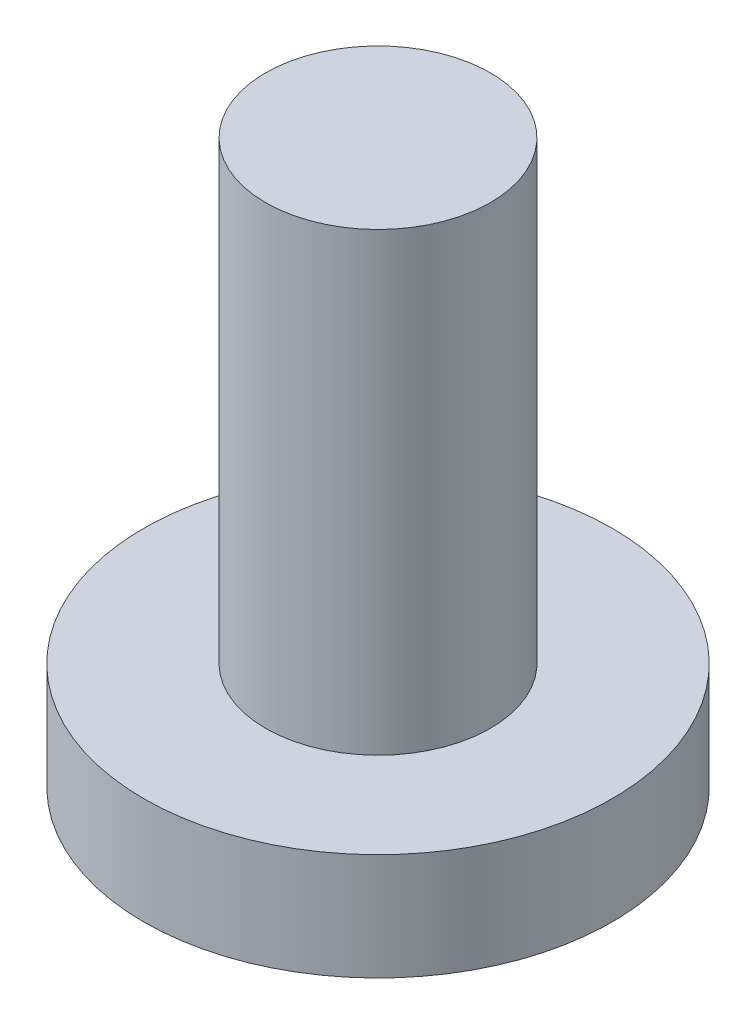
ISO-10303-21;
HEADER;
FILE_DESCRIPTION(('STEP AP214'),'2;1');
FILE_NAME('part.step','',(''),(''),'','','');
FILE_SCHEMA(('AUTOMOTIVE_DESIGN { 1 0 10303 214 1 1 1 1 }'));
ENDSEC;
DATA;
#1=APPLICATION_CONTEXT('core data for automotive mechanical design processes');
#2=APPLICATION_PROTOCOL_DEFINITION('international standard','automotive_design',2000,#1);
#3=PRODUCT_CONTEXT('',#1,'mechanical');
#4=PRODUCT('Part','Part','',(#3));
#5=PRODUCT_RELATED_PRODUCT_CATEGORY('part','',(#4));
#6=PRODUCT_DEFINITION_FORMATION('','',#4);
#7=PRODUCT_DEFINITION_CONTEXT('part definition',#1,'design');
#8=PRODUCT_DEFINITION('design','',#6,#7);
#9=PRODUCT_DEFINITION_SHAPE('','',#8);
#10=(LENGTH_UNIT() NAMED_UNIT(*) SI_UNIT(.MILLI.,.METRE.));
#11=(NAMED_UNIT(*) PLANE_ANGLE_UNIT() SI_UNIT($,.RADIAN.));
#12=(NAMED_UNIT(*) SI_UNIT($,.STERADIAN.) SOLID_ANGLE_UNIT());
#13=UNCERTAINTY_MEASURE_WITH_UNIT(LENGTH_MEASURE(1.E-05),#10,'distance_accuracy_value','');
#14=(GEOMETRIC_REPRESENTATION_CONTEXT(3) GLOBAL_UNCERTAINTY_ASSIGNED_CONTEXT((#13)) GLOBAL_UNIT_ASSIGNED_CONTEXT((#10,
#11,#12)) REPRESENTATION_CONTEXT('',''));
#15=CARTESIAN_POINT('',(0.,0.,0.));
#16=DIRECTION('',(0.,0.,1.));
#17=DIRECTION('',(1.,0.,0.));
#18=AXIS2_PLACEMENT_3D('',#15,#16,#17);
#19=CARTESIAN_POINT('',(0.,3.42,0.));
#20=DIRECTION('',(0.,1.,0.));
#21=DIRECTION('',(0.,0.,1.));
#22=AXIS2_PLACEMENT_3D('',#19,#20,#21);
#23=PLANE('',#22);
#24=CARTESIAN_POINT('',(0.,3.42,0.));
#25=DIRECTION('',(0.,1.,0.));
#26=DIRECTION('',(0.,0.,1.));
#27=AXIS2_PLACEMENT_3D('',#24,#25,#26);
#28=CIRCLE('',#27,7.5);
#29=CARTESIAN_POINT('',(0.,3.42,7.5));
#30=VERTEX_POINT('',#29);
#31=EDGE_CURVE('E10',#30,#30,#28,.T.);
#32=ORIENTED_EDGE('',*,*,#31,.T.);
#33=EDGE_LOOP('',(#32));
#34=FACE_BOUND('',#33,.T.);
#35=CARTESIAN_POINT('',(0.,3.42,0.));
#36=DIRECTION('',(0.,1.,0.));
#37=DIRECTION('',(0.,0.,1.));
#38=AXIS2_PLACEMENT_3D('',#35,#36,#37);
#39=CIRCLE('',#38,3.6);
#40=CARTESIAN_POINT('',(0.,3.42,3.6));
#41=VERTEX_POINT('',#40);
#42=EDGE_CURVE('E45',#41,#41,#39,.T.);
#43=ORIENTED_EDGE('',*,*,#42,.F.);
#44=EDGE_LOOP('',(#43));
#45=FACE_BOUND('',#44,.T.);
#46=ADVANCED_FACE('F34',(#34,#45),#23,.T.);
#47=CARTESIAN_POINT('',(0.,0.,0.));
#48=DIRECTION('',(0.,1.,0.));
#49=DIRECTION('',(0.,0.,1.));
#50=AXIS2_PLACEMENT_3D('',#47,#48,#49);
#51=PLANE('',#50);
#52=CARTESIAN_POINT('',(0.,0.,0.));
#53=DIRECTION('',(0.,1.,0.));
#54=DIRECTION('',(0.,0.,1.));
#55=AXIS2_PLACEMENT_3D('',#52,#53,#54);
#56=CIRCLE('',#55,7.5);
#57=CARTESIAN_POINT('',(0.,0.,7.5));
#58=VERTEX_POINT('',#57);
#59=EDGE_CURVE('E38',#58,#58,#56,.T.);
#60=ORIENTED_EDGE('',*,*,#59,.F.);
#61=EDGE_LOOP('',(#60));
#62=FACE_BOUND('',#61,.T.);
#63=ADVANCED_FACE('F64',(#62),#51,.F.);
#64=CARTESIAN_POINT('',(0.,3.42,0.));
#65=DIRECTION('',(0.,-1.,0.));
#66=DIRECTION('',(0.,0.,-1.));
#67=AXIS2_PLACEMENT_3D('',#64,#65,#66);
#68=CYLINDRICAL_SURFACE('',#67,7.5);
#69=ORIENTED_EDGE('',*,*,#31,.F.);
#70=EDGE_LOOP('',(#69));
#71=FACE_BOUND('',#70,.T.);
#72=ORIENTED_EDGE('',*,*,#59,.T.);
#73=EDGE_LOOP('',(#72));
#74=FACE_BOUND('',#73,.T.);
#75=ADVANCED_FACE('F36',(#71,#74),#68,.T.);
#76=CARTESIAN_POINT('',(0.,18.,0.));
#77=DIRECTION('',(0.,-1.,0.));
#78=DIRECTION('',(0.,0.,-1.));
#79=AXIS2_PLACEMENT_3D('',#76,#77,#78);
#80=CYLINDRICAL_SURFACE('',#79,3.6);
#81=ORIENTED_EDGE('',*,*,#42,.T.);
#82=EDGE_LOOP('',(#81));
#83=FACE_BOUND('',#82,.T.);
#84=CARTESIAN_POINT('',(0.,18.,0.));
#85=DIRECTION('',(0.,1.,0.));
#86=DIRECTION('',(0.,0.,1.));
#87=AXIS2_PLACEMENT_3D('',#84,#85,#86);
#88=CIRCLE('',#87,3.6);
#89=CARTESIAN_POINT('',(0.,18.,3.6));
#90=VERTEX_POINT('',#89);
#91=EDGE_CURVE('E49',#90,#90,#88,.T.);
#92=ORIENTED_EDGE('',*,*,#91,.F.);
#93=EDGE_LOOP('',(#92));
#94=FACE_BOUND('',#93,.T.);
#95=ADVANCED_FACE('F55',(#83,#94),#80,.T.);
#96=CARTESIAN_POINT('',(0.,18.,0.));
#97=DIRECTION('',(0.,1.,0.));
#98=DIRECTION('',(0.,0.,1.));
#99=AXIS2_PLACEMENT_3D('',#96,#97,#98);
#100=PLANE('',#99);
#101=ORIENTED_EDGE('',*,*,#91,.T.);
#102=EDGE_LOOP('',(#101));
#103=FACE_BOUND('',#102,.T.);
#104=ADVANCED_FACE('F53',(#103),#100,.T.);
#105=CLOSED_SHELL('',(#46,#63,#75,#95,#104));
#106=MANIFOLD_SOLID_BREP('B2',#105);
#107=ADVANCED_BREP_SHAPE_REPRESENTATION('',(#18,#106),#14);
#108=SHAPE_DEFINITION_REPRESENTATION(#9,#107);
ENDSEC;
END-ISO-10303-21;
